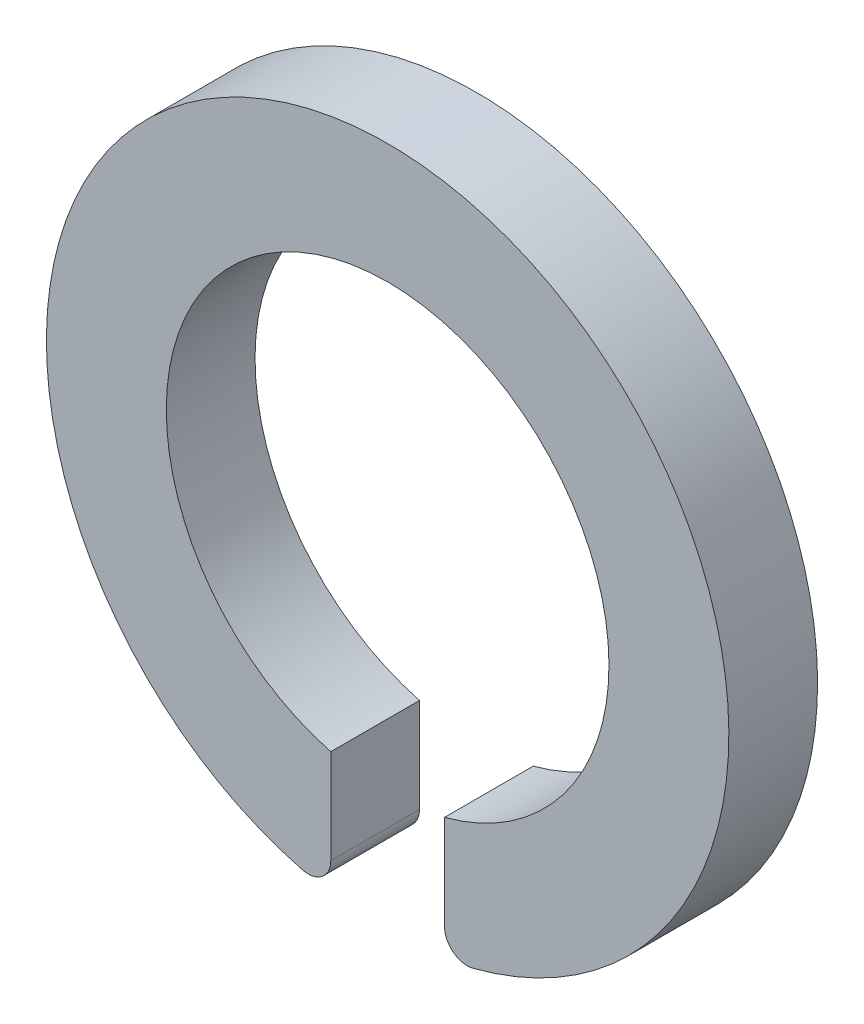
ISO-10303-21;
HEADER;
FILE_DESCRIPTION(('STEP AP214'),'2;1');
FILE_NAME('part.step','',(''),(''),'','','');
FILE_SCHEMA(('AUTOMOTIVE_DESIGN { 1 0 10303 214 1 1 1 1 }'));
ENDSEC;
DATA;
#1=APPLICATION_CONTEXT('core data for automotive mechanical design processes');
#2=APPLICATION_PROTOCOL_DEFINITION('international standard','automotive_design',2000,#1);
#3=PRODUCT_CONTEXT('',#1,'mechanical');
#4=PRODUCT('Part','Part','',(#3));
#5=PRODUCT_RELATED_PRODUCT_CATEGORY('part','',(#4));
#6=PRODUCT_DEFINITION_FORMATION('','',#4);
#7=PRODUCT_DEFINITION_CONTEXT('part definition',#1,'design');
#8=PRODUCT_DEFINITION('design','',#6,#7);
#9=PRODUCT_DEFINITION_SHAPE('','',#8);
#10=(LENGTH_UNIT() NAMED_UNIT(*) SI_UNIT(.MILLI.,.METRE.));
#11=(NAMED_UNIT(*) PLANE_ANGLE_UNIT() SI_UNIT($,.RADIAN.));
#12=(NAMED_UNIT(*) SI_UNIT($,.STERADIAN.) SOLID_ANGLE_UNIT());
#13=UNCERTAINTY_MEASURE_WITH_UNIT(LENGTH_MEASURE(1.E-05),#10,'distance_accuracy_value','');
#14=(GEOMETRIC_REPRESENTATION_CONTEXT(3) GLOBAL_UNCERTAINTY_ASSIGNED_CONTEXT((#13)) GLOBAL_UNIT_ASSIGNED_CONTEXT((#10,
#11,#12)) REPRESENTATION_CONTEXT('',''));
#15=CARTESIAN_POINT('',(0.,0.,0.));
#16=DIRECTION('',(0.,0.,1.));
#17=DIRECTION('',(1.,0.,0.));
#18=AXIS2_PLACEMENT_3D('',#15,#16,#17);
#19=CARTESIAN_POINT('',(0.,0.,1.95));
#20=DIRECTION('',(0.,0.,1.));
#21=DIRECTION('',(1.,0.,0.));
#22=AXIS2_PLACEMENT_3D('',#19,#20,#21);
#23=PLANE('',#22);
#24=DIRECTION('',(0.,1.,0.));
#25=VECTOR('',#24,1.);
#26=CARTESIAN_POINT('',(1.25,-3.76776511484129,1.95));
#27=LINE('',#26,#25);
#28=CARTESIAN_POINT('',(1.25,-6.77772085586298,1.95));
#29=VERTEX_POINT('',#28);
#30=CARTESIAN_POINT('',(1.25,-4.70167257473338,1.95));
#31=VERTEX_POINT('',#30);
#32=EDGE_CURVE('E101',#29,#31,#27,.T.);
#33=ORIENTED_EDGE('',*,*,#32,.F.);
#34=CARTESIAN_POINT('',(1.75,-6.77772085586298,1.95));
#35=DIRECTION('',(0.,0.,1.));
#36=DIRECTION('',(1.,0.,0.));
#37=AXIS2_PLACEMENT_3D('',#34,#35,#36);
#38=CIRCLE('',#37,0.5);
#39=CARTESIAN_POINT('',(1.875,-7.26184377413891,1.95));
#40=VERTEX_POINT('',#39);
#41=EDGE_CURVE('E41',#29,#40,#38,.T.);
#42=ORIENTED_EDGE('',*,*,#41,.T.);
#43=CARTESIAN_POINT('',(0.,0.,1.95));
#44=DIRECTION('',(0.,0.,1.));
#45=DIRECTION('',(1.,0.,0.));
#46=AXIS2_PLACEMENT_3D('',#43,#44,#45);
#47=CIRCLE('',#46,7.5);
#48=CARTESIAN_POINT('',(-1.875,-7.26184377413891,1.95));
#49=VERTEX_POINT('',#48);
#50=EDGE_CURVE('E110',#40,#49,#47,.T.);
#51=ORIENTED_EDGE('',*,*,#50,.T.);
#52=CARTESIAN_POINT('',(-1.75,-6.77772085586298,1.95));
#53=DIRECTION('',(0.,0.,1.));
#54=DIRECTION('',(1.,0.,0.));
#55=AXIS2_PLACEMENT_3D('',#52,#53,#54);
#56=CIRCLE('',#55,0.5);
#57=CARTESIAN_POINT('',(-1.25,-6.77772085586298,1.95));
#58=VERTEX_POINT('',#57);
#59=EDGE_CURVE('E48',#49,#58,#56,.T.);
#60=ORIENTED_EDGE('',*,*,#59,.T.);
#61=DIRECTION('',(0.,-1.,0.));
#62=VECTOR('',#61,1.);
#63=CARTESIAN_POINT('',(-1.25,-3.76776511484129,1.95));
#64=LINE('',#63,#62);
#65=CARTESIAN_POINT('',(-1.25,-4.70167257473338,1.95));
#66=VERTEX_POINT('',#65);
#67=EDGE_CURVE('E88',#66,#58,#64,.T.);
#68=ORIENTED_EDGE('',*,*,#67,.F.);
#69=CARTESIAN_POINT('',(0.,0.,1.95));
#70=DIRECTION('',(0.,0.,1.));
#71=DIRECTION('',(1.,0.,0.));
#72=AXIS2_PLACEMENT_3D('',#69,#70,#71);
#73=CIRCLE('',#72,4.865);
#74=EDGE_CURVE('E100',#31,#66,#73,.T.);
#75=ORIENTED_EDGE('',*,*,#74,.F.);
#76=EDGE_LOOP('',(#33,#42,#51,#60,#68,#75));
#77=FACE_BOUND('',#76,.T.);
#78=ADVANCED_FACE('F33',(#77),#23,.T.);
#79=CARTESIAN_POINT('',(0.,0.,0.));
#80=DIRECTION('',(0.,0.,1.));
#81=DIRECTION('',(1.,0.,0.));
#82=AXIS2_PLACEMENT_3D('',#79,#80,#81);
#83=PLANE('',#82);
#84=CARTESIAN_POINT('',(0.,0.,0.));
#85=DIRECTION('',(0.,0.,1.));
#86=DIRECTION('',(1.,0.,0.));
#87=AXIS2_PLACEMENT_3D('',#84,#85,#86);
#88=CIRCLE('',#87,7.5);
#89=CARTESIAN_POINT('',(1.875,-7.26184377413891,0.));
#90=VERTEX_POINT('',#89);
#91=CARTESIAN_POINT('',(-1.875,-7.26184377413891,0.));
#92=VERTEX_POINT('',#91);
#93=EDGE_CURVE('E106',#90,#92,#88,.T.);
#94=ORIENTED_EDGE('',*,*,#93,.F.);
#95=CARTESIAN_POINT('',(1.75,-6.77772085586298,0.));
#96=DIRECTION('',(0.,0.,1.));
#97=DIRECTION('',(1.,0.,0.));
#98=AXIS2_PLACEMENT_3D('',#95,#96,#97);
#99=CIRCLE('',#98,0.5);
#100=CARTESIAN_POINT('',(1.25,-6.77772085586298,0.));
#101=VERTEX_POINT('',#100);
#102=EDGE_CURVE('E125',#90,#101,#99,.F.);
#103=ORIENTED_EDGE('',*,*,#102,.T.);
#104=DIRECTION('',(0.,1.,0.));
#105=VECTOR('',#104,1.);
#106=CARTESIAN_POINT('',(1.25,-3.76776511484129,0.));
#107=LINE('',#106,#105);
#108=CARTESIAN_POINT('',(1.25,-4.70167257473338,0.));
#109=VERTEX_POINT('',#108);
#110=EDGE_CURVE('E112',#101,#109,#107,.T.);
#111=ORIENTED_EDGE('',*,*,#110,.T.);
#112=CARTESIAN_POINT('',(0.,0.,0.));
#113=DIRECTION('',(0.,0.,1.));
#114=DIRECTION('',(1.,0.,0.));
#115=AXIS2_PLACEMENT_3D('',#112,#113,#114);
#116=CIRCLE('',#115,4.865);
#117=CARTESIAN_POINT('',(-1.25,-4.70167257473338,0.));
#118=VERTEX_POINT('',#117);
#119=EDGE_CURVE('E107',#109,#118,#116,.T.);
#120=ORIENTED_EDGE('',*,*,#119,.T.);
#121=DIRECTION('',(0.,-1.,0.));
#122=VECTOR('',#121,1.);
#123=CARTESIAN_POINT('',(-1.25,-3.76776511484129,0.));
#124=LINE('',#123,#122);
#125=CARTESIAN_POINT('',(-1.25,-6.77772085586298,0.));
#126=VERTEX_POINT('',#125);
#127=EDGE_CURVE('E91',#118,#126,#124,.T.);
#128=ORIENTED_EDGE('',*,*,#127,.T.);
#129=CARTESIAN_POINT('',(-1.75,-6.77772085586298,0.));
#130=DIRECTION('',(0.,0.,1.));
#131=DIRECTION('',(1.,0.,0.));
#132=AXIS2_PLACEMENT_3D('',#129,#130,#131);
#133=CIRCLE('',#132,0.5);
#134=EDGE_CURVE('E123',#126,#92,#133,.F.);
#135=ORIENTED_EDGE('',*,*,#134,.T.);
#136=EDGE_LOOP('',(#94,#103,#111,#120,#128,#135));
#137=FACE_BOUND('',#136,.T.);
#138=ADVANCED_FACE('F138',(#137),#83,.F.);
#139=CARTESIAN_POINT('',(0.,0.,1.95));
#140=DIRECTION('',(0.,0.,-1.));
#141=DIRECTION('',(-1.,0.,0.));
#142=AXIS2_PLACEMENT_3D('',#139,#140,#141);
#143=CYLINDRICAL_SURFACE('',#142,7.5);
#144=ORIENTED_EDGE('',*,*,#50,.F.);
#145=DIRECTION('',(0.,0.,-1.));
#146=VECTOR('',#145,1.);
#147=CARTESIAN_POINT('',(1.875,-7.26184377413891,1.95));
#148=LINE('',#147,#146);
#149=EDGE_CURVE('E120',#40,#90,#148,.T.);
#150=ORIENTED_EDGE('',*,*,#149,.T.);
#151=ORIENTED_EDGE('',*,*,#93,.T.);
#152=DIRECTION('',(0.,0.,-1.));
#153=VECTOR('',#152,1.);
#154=CARTESIAN_POINT('',(-1.875,-7.26184377413891,1.95));
#155=LINE('',#154,#153);
#156=EDGE_CURVE('E96',#92,#49,#155,.F.);
#157=ORIENTED_EDGE('',*,*,#156,.T.);
#158=EDGE_LOOP('',(#144,#150,#151,#157));
#159=FACE_BOUND('',#158,.T.);
#160=ADVANCED_FACE('F133',(#159),#143,.T.);
#161=CARTESIAN_POINT('',(0.,0.,1.95));
#162=DIRECTION('',(0.,0.,-1.));
#163=DIRECTION('',(-1.,0.,0.));
#164=AXIS2_PLACEMENT_3D('',#161,#162,#163);
#165=CYLINDRICAL_SURFACE('',#164,4.865);
#166=DIRECTION('',(0.,0.,-1.));
#167=VECTOR('',#166,1.);
#168=CARTESIAN_POINT('',(-1.25,-4.70167257473338,1.95));
#169=LINE('',#168,#167);
#170=EDGE_CURVE('E86',#118,#66,#169,.F.);
#171=ORIENTED_EDGE('',*,*,#170,.F.);
#172=ORIENTED_EDGE('',*,*,#119,.F.);
#173=DIRECTION('',(0.,0.,-1.));
#174=VECTOR('',#173,1.);
#175=CARTESIAN_POINT('',(1.25,-4.70167257473338,1.95));
#176=LINE('',#175,#174);
#177=EDGE_CURVE('E97',#31,#109,#176,.T.);
#178=ORIENTED_EDGE('',*,*,#177,.F.);
#179=ORIENTED_EDGE('',*,*,#74,.T.);
#180=EDGE_LOOP('',(#171,#172,#178,#179));
#181=FACE_BOUND('',#180,.T.);
#182=ADVANCED_FACE('F104',(#181),#165,.F.);
#183=CARTESIAN_POINT('',(1.25,-3.76776511484129,0.));
#184=DIRECTION('',(1.,0.,0.));
#185=DIRECTION('',(0.,1.,0.));
#186=AXIS2_PLACEMENT_3D('',#183,#184,#185);
#187=PLANE('',#186);
#188=ORIENTED_EDGE('',*,*,#110,.F.);
#189=DIRECTION('',(0.,0.,-1.));
#190=VECTOR('',#189,1.);
#191=CARTESIAN_POINT('',(1.25,-6.77772085586298,0.));
#192=LINE('',#191,#190);
#193=EDGE_CURVE('E56',#101,#29,#192,.F.);
#194=ORIENTED_EDGE('',*,*,#193,.T.);
#195=ORIENTED_EDGE('',*,*,#32,.T.);
#196=ORIENTED_EDGE('',*,*,#177,.T.);
#197=EDGE_LOOP('',(#188,#194,#195,#196));
#198=FACE_BOUND('',#197,.T.);
#199=ADVANCED_FACE('F139',(#198),#187,.F.);
#200=CARTESIAN_POINT('',(-1.25,-3.76776511484129,0.));
#201=DIRECTION('',(-1.,0.,0.));
#202=DIRECTION('',(0.,-1.,0.));
#203=AXIS2_PLACEMENT_3D('',#200,#201,#202);
#204=PLANE('',#203);
#205=ORIENTED_EDGE('',*,*,#67,.T.);
#206=DIRECTION('',(0.,0.,-1.));
#207=VECTOR('',#206,1.);
#208=CARTESIAN_POINT('',(-1.25,-6.77772085586298,0.));
#209=LINE('',#208,#207);
#210=EDGE_CURVE('E11',#58,#126,#209,.T.);
#211=ORIENTED_EDGE('',*,*,#210,.T.);
#212=ORIENTED_EDGE('',*,*,#127,.F.);
#213=ORIENTED_EDGE('',*,*,#170,.T.);
#214=EDGE_LOOP('',(#205,#211,#212,#213));
#215=FACE_BOUND('',#214,.T.);
#216=ADVANCED_FACE('F87',(#215),#204,.F.);
#217=CARTESIAN_POINT('',(1.75,-6.77772085586298,1.95));
#218=DIRECTION('',(0.,0.,-1.));
#219=DIRECTION('',(-1.,0.,0.));
#220=AXIS2_PLACEMENT_3D('',#217,#218,#219);
#221=CYLINDRICAL_SURFACE('',#220,0.5);
#222=ORIENTED_EDGE('',*,*,#41,.F.);
#223=ORIENTED_EDGE('',*,*,#193,.F.);
#224=ORIENTED_EDGE('',*,*,#102,.F.);
#225=ORIENTED_EDGE('',*,*,#149,.F.);
#226=EDGE_LOOP('',(#222,#223,#224,#225));
#227=FACE_BOUND('',#226,.T.);
#228=ADVANCED_FACE('F136',(#227),#221,.T.);
#229=CARTESIAN_POINT('',(-1.75,-6.77772085586298,1.95));
#230=DIRECTION('',(0.,0.,-1.));
#231=DIRECTION('',(-1.,0.,0.));
#232=AXIS2_PLACEMENT_3D('',#229,#230,#231);
#233=CYLINDRICAL_SURFACE('',#232,0.5);
#234=ORIENTED_EDGE('',*,*,#134,.F.);
#235=ORIENTED_EDGE('',*,*,#210,.F.);
#236=ORIENTED_EDGE('',*,*,#59,.F.);
#237=ORIENTED_EDGE('',*,*,#156,.F.);
#238=EDGE_LOOP('',(#234,#235,#236,#237));
#239=FACE_BOUND('',#238,.T.);
#240=ADVANCED_FACE('F35',(#239),#233,.T.);
#241=CLOSED_SHELL('',(#78,#138,#160,#182,#199,#216,#228,#240));
#242=MANIFOLD_SOLID_BREP('B2',#241);
#243=ADVANCED_BREP_SHAPE_REPRESENTATION('',(#18,#242),#14);
#244=SHAPE_DEFINITION_REPRESENTATION(#9,#243);
ENDSEC;
END-ISO-10303-21;
